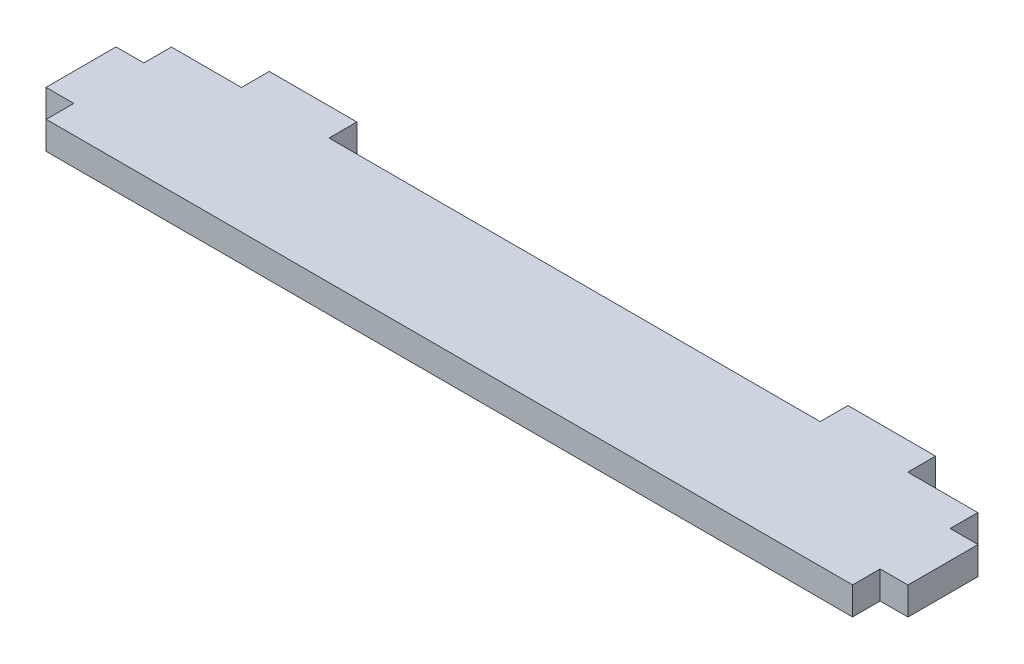
ISO-10303-21;
HEADER;
FILE_DESCRIPTION(('STEP AP214'),'2;1');
FILE_NAME('part.step','',(''),(''),'','','');
FILE_SCHEMA(('AUTOMOTIVE_DESIGN { 1 0 10303 214 1 1 1 1 }'));
ENDSEC;
DATA;
#1=APPLICATION_CONTEXT('core data for automotive mechanical design processes');
#2=APPLICATION_PROTOCOL_DEFINITION('international standard','automotive_design',2000,#1);
#3=PRODUCT_CONTEXT('',#1,'mechanical');
#4=PRODUCT('Part','Part','',(#3));
#5=PRODUCT_RELATED_PRODUCT_CATEGORY('part','',(#4));
#6=PRODUCT_DEFINITION_FORMATION('','',#4);
#7=PRODUCT_DEFINITION_CONTEXT('part definition',#1,'design');
#8=PRODUCT_DEFINITION('design','',#6,#7);
#9=PRODUCT_DEFINITION_SHAPE('','',#8);
#10=(LENGTH_UNIT() NAMED_UNIT(*) SI_UNIT(.MILLI.,.METRE.));
#11=(NAMED_UNIT(*) PLANE_ANGLE_UNIT() SI_UNIT($,.RADIAN.));
#12=(NAMED_UNIT(*) SI_UNIT($,.STERADIAN.) SOLID_ANGLE_UNIT());
#13=UNCERTAINTY_MEASURE_WITH_UNIT(LENGTH_MEASURE(1.E-05),#10,'distance_accuracy_value','');
#14=(GEOMETRIC_REPRESENTATION_CONTEXT(3) GLOBAL_UNCERTAINTY_ASSIGNED_CONTEXT((#13)) GLOBAL_UNIT_ASSIGNED_CONTEXT((#10,
#11,#12)) REPRESENTATION_CONTEXT('',''));
#15=CARTESIAN_POINT('',(0.,0.,0.));
#16=DIRECTION('',(0.,0.,1.));
#17=DIRECTION('',(1.,0.,0.));
#18=AXIS2_PLACEMENT_3D('',#15,#16,#17);
#19=CARTESIAN_POINT('',(46.05,3.175,7.15));
#20=DIRECTION('',(-1.,0.,0.));
#21=DIRECTION('',(0.,0.,1.));
#22=AXIS2_PLACEMENT_3D('',#19,#20,#21);
#23=PLANE('',#22);
#24=DIRECTION('',(0.,0.,-1.));
#25=VECTOR('',#24,1.);
#26=CARTESIAN_POINT('',(46.05,3.175,7.15));
#27=LINE('',#26,#25);
#28=CARTESIAN_POINT('',(46.05,3.175,-4.));
#29=VERTEX_POINT('',#28);
#30=CARTESIAN_POINT('',(46.05,3.175,-7.15000000000001));
#31=VERTEX_POINT('',#30);
#32=EDGE_CURVE('E305',#29,#31,#27,.T.);
#33=ORIENTED_EDGE('',*,*,#32,.F.);
#34=DIRECTION('',(0.,-1.,0.));
#35=VECTOR('',#34,1.);
#36=CARTESIAN_POINT('',(46.05,0.,-4.));
#37=LINE('',#36,#35);
#38=CARTESIAN_POINT('',(46.05,0.,-4.));
#39=VERTEX_POINT('',#38);
#40=EDGE_CURVE('E180',#29,#39,#37,.T.);
#41=ORIENTED_EDGE('',*,*,#40,.T.);
#42=DIRECTION('',(0.,0.,-1.));
#43=VECTOR('',#42,1.);
#44=CARTESIAN_POINT('',(46.05,0.,7.15));
#45=LINE('',#44,#43);
#46=CARTESIAN_POINT('',(46.05,0.,-7.15000000000001));
#47=VERTEX_POINT('',#46);
#48=EDGE_CURVE('E322',#39,#47,#45,.T.);
#49=ORIENTED_EDGE('',*,*,#48,.T.);
#50=DIRECTION('',(0.,-1.,0.));
#51=VECTOR('',#50,1.);
#52=CARTESIAN_POINT('',(46.05,3.175,-7.15000000000001));
#53=LINE('',#52,#51);
#54=EDGE_CURVE('E332',#31,#47,#53,.T.);
#55=ORIENTED_EDGE('',*,*,#54,.F.);
#56=EDGE_LOOP('',(#33,#41,#49,#55));
#57=FACE_BOUND('',#56,.T.);
#58=ADVANCED_FACE('F35',(#57),#23,.F.);
#59=CARTESIAN_POINT('',(-46.05,3.175,7.15000000000001));
#60=DIRECTION('',(1.,0.,0.));
#61=DIRECTION('',(0.,0.,-1.));
#62=AXIS2_PLACEMENT_3D('',#59,#60,#61);
#63=PLANE('',#62);
#64=DIRECTION('',(0.,-1.,0.));
#65=VECTOR('',#64,1.);
#66=CARTESIAN_POINT('',(-46.05,0.,-4.));
#67=LINE('',#66,#65);
#68=CARTESIAN_POINT('',(-46.05,3.175,-4.));
#69=VERTEX_POINT('',#68);
#70=CARTESIAN_POINT('',(-46.05,0.,-4.));
#71=VERTEX_POINT('',#70);
#72=EDGE_CURVE('E58',#69,#71,#67,.T.);
#73=ORIENTED_EDGE('',*,*,#72,.F.);
#74=DIRECTION('',(0.,0.,1.));
#75=VECTOR('',#74,1.);
#76=CARTESIAN_POINT('',(-46.05,3.175,7.15000000000001));
#77=LINE('',#76,#75);
#78=CARTESIAN_POINT('',(-46.05,3.175,-7.14999999999999));
#79=VERTEX_POINT('',#78);
#80=EDGE_CURVE('E298',#79,#69,#77,.T.);
#81=ORIENTED_EDGE('',*,*,#80,.F.);
#82=DIRECTION('',(0.,-1.,0.));
#83=VECTOR('',#82,1.);
#84=CARTESIAN_POINT('',(-46.05,3.175,-7.14999999999999));
#85=LINE('',#84,#83);
#86=CARTESIAN_POINT('',(-46.05,0.,-7.14999999999999));
#87=VERTEX_POINT('',#86);
#88=EDGE_CURVE('E314',#79,#87,#85,.T.);
#89=ORIENTED_EDGE('',*,*,#88,.T.);
#90=DIRECTION('',(0.,0.,1.));
#91=VECTOR('',#90,1.);
#92=CARTESIAN_POINT('',(-46.05,0.,7.15000000000001));
#93=LINE('',#92,#91);
#94=EDGE_CURVE('E316',#87,#71,#93,.T.);
#95=ORIENTED_EDGE('',*,*,#94,.T.);
#96=EDGE_LOOP('',(#73,#81,#89,#95));
#97=FACE_BOUND('',#96,.T.);
#98=ADVANCED_FACE('F37',(#97),#63,.F.);
#99=DIRECTION('',(0.,1.,0.));
#100=VECTOR('',#99,1.);
#101=CARTESIAN_POINT('',(-46.05,0.,4.));
#102=LINE('',#101,#100);
#103=CARTESIAN_POINT('',(-46.05,0.,4.));
#104=VERTEX_POINT('',#103);
#105=CARTESIAN_POINT('',(-46.05,3.175,4.));
#106=VERTEX_POINT('',#105);
#107=EDGE_CURVE('E217',#104,#106,#102,.T.);
#108=ORIENTED_EDGE('',*,*,#107,.F.);
#109=CARTESIAN_POINT('',(-46.05,0.,7.15000000000001));
#110=VERTEX_POINT('',#109);
#111=EDGE_CURVE('E297',#104,#110,#93,.T.);
#112=ORIENTED_EDGE('',*,*,#111,.T.);
#113=DIRECTION('',(0.,-1.,0.));
#114=VECTOR('',#113,1.);
#115=CARTESIAN_POINT('',(-46.05,3.175,7.15000000000001));
#116=LINE('',#115,#114);
#117=CARTESIAN_POINT('',(-46.05,3.175,7.15000000000001));
#118=VERTEX_POINT('',#117);
#119=EDGE_CURVE('E12',#118,#110,#116,.T.);
#120=ORIENTED_EDGE('',*,*,#119,.F.);
#121=EDGE_CURVE('E302',#106,#118,#77,.T.);
#122=ORIENTED_EDGE('',*,*,#121,.F.);
#123=EDGE_LOOP('',(#108,#112,#120,#122));
#124=FACE_BOUND('',#123,.T.);
#125=ADVANCED_FACE('F411',(#124),#63,.F.);
#126=CARTESIAN_POINT('',(46.05,3.175,-7.15000000000001));
#127=DIRECTION('',(0.,0.,1.));
#128=DIRECTION('',(1.,0.,0.));
#129=AXIS2_PLACEMENT_3D('',#126,#127,#128);
#130=PLANE('',#129);
#131=DIRECTION('',(0.,1.,0.));
#132=VECTOR('',#131,1.);
#133=CARTESIAN_POINT('',(-38.05,0.,-7.15));
#134=LINE('',#133,#132);
#135=CARTESIAN_POINT('',(-38.05,0.,-7.15));
#136=VERTEX_POINT('',#135);
#137=CARTESIAN_POINT('',(-38.05,3.175,-7.15));
#138=VERTEX_POINT('',#137);
#139=EDGE_CURVE('E246',#136,#138,#134,.T.);
#140=ORIENTED_EDGE('',*,*,#139,.F.);
#141=DIRECTION('',(-1.,0.,0.));
#142=VECTOR('',#141,1.);
#143=CARTESIAN_POINT('',(46.05,0.,-7.15000000000001));
#144=LINE('',#143,#142);
#145=EDGE_CURVE('E326',#136,#87,#144,.T.);
#146=ORIENTED_EDGE('',*,*,#145,.T.);
#147=ORIENTED_EDGE('',*,*,#88,.F.);
#148=DIRECTION('',(-1.,0.,0.));
#149=VECTOR('',#148,1.);
#150=CARTESIAN_POINT('',(46.05,3.175,-7.15000000000001));
#151=LINE('',#150,#149);
#152=EDGE_CURVE('E308',#138,#79,#151,.T.);
#153=ORIENTED_EDGE('',*,*,#152,.F.);
#154=EDGE_LOOP('',(#140,#146,#147,#153));
#155=FACE_BOUND('',#154,.T.);
#156=ADVANCED_FACE('F390',(#155),#130,.F.);
#157=DIRECTION('',(0.,-1.,0.));
#158=VECTOR('',#157,1.);
#159=CARTESIAN_POINT('',(-28.05,0.,-7.15));
#160=LINE('',#159,#158);
#161=CARTESIAN_POINT('',(-28.05,3.175,-7.15));
#162=VERTEX_POINT('',#161);
#163=CARTESIAN_POINT('',(-28.05,0.,-7.15));
#164=VERTEX_POINT('',#163);
#165=EDGE_CURVE('E251',#162,#164,#160,.T.);
#166=ORIENTED_EDGE('',*,*,#165,.F.);
#167=CARTESIAN_POINT('',(28.05,3.175,-7.15));
#168=VERTEX_POINT('',#167);
#169=EDGE_CURVE('E315',#168,#162,#151,.T.);
#170=ORIENTED_EDGE('',*,*,#169,.F.);
#171=DIRECTION('',(0.,1.,0.));
#172=VECTOR('',#171,1.);
#173=CARTESIAN_POINT('',(28.05,0.,-7.15));
#174=LINE('',#173,#172);
#175=CARTESIAN_POINT('',(28.05,0.,-7.15));
#176=VERTEX_POINT('',#175);
#177=EDGE_CURVE('E273',#176,#168,#174,.T.);
#178=ORIENTED_EDGE('',*,*,#177,.F.);
#179=EDGE_CURVE('E329',#176,#164,#144,.T.);
#180=ORIENTED_EDGE('',*,*,#179,.T.);
#181=EDGE_LOOP('',(#166,#170,#178,#180));
#182=FACE_BOUND('',#181,.T.);
#183=ADVANCED_FACE('F381',(#182),#130,.F.);
#184=DIRECTION('',(0.,-1.,0.));
#185=VECTOR('',#184,1.);
#186=CARTESIAN_POINT('',(38.05,0.,-7.15));
#187=LINE('',#186,#185);
#188=CARTESIAN_POINT('',(38.05,3.175,-7.15));
#189=VERTEX_POINT('',#188);
#190=CARTESIAN_POINT('',(38.05,0.,-7.15));
#191=VERTEX_POINT('',#190);
#192=EDGE_CURVE('E265',#189,#191,#187,.T.);
#193=ORIENTED_EDGE('',*,*,#192,.F.);
#194=EDGE_CURVE('E309',#31,#189,#151,.T.);
#195=ORIENTED_EDGE('',*,*,#194,.F.);
#196=ORIENTED_EDGE('',*,*,#54,.T.);
#197=EDGE_CURVE('E327',#47,#191,#144,.T.);
#198=ORIENTED_EDGE('',*,*,#197,.T.);
#199=EDGE_LOOP('',(#193,#195,#196,#198));
#200=FACE_BOUND('',#199,.T.);
#201=ADVANCED_FACE('F360',(#200),#130,.F.);
#202=CARTESIAN_POINT('',(46.05,3.175,7.15));
#203=DIRECTION('',(0.,0.,-1.));
#204=DIRECTION('',(-1.,0.,0.));
#205=AXIS2_PLACEMENT_3D('',#202,#203,#204);
#206=PLANE('',#205);
#207=DIRECTION('',(1.,0.,0.));
#208=VECTOR('',#207,1.);
#209=CARTESIAN_POINT('',(46.05,0.,7.15));
#210=LINE('',#209,#208);
#211=CARTESIAN_POINT('',(46.05,0.,7.15));
#212=VERTEX_POINT('',#211);
#213=EDGE_CURVE('E320',#110,#212,#210,.T.);
#214=ORIENTED_EDGE('',*,*,#213,.T.);
#215=DIRECTION('',(0.,-1.,0.));
#216=VECTOR('',#215,1.);
#217=CARTESIAN_POINT('',(46.05,3.175,7.15));
#218=LINE('',#217,#216);
#219=CARTESIAN_POINT('',(46.05,3.175,7.15));
#220=VERTEX_POINT('',#219);
#221=EDGE_CURVE('E43',#220,#212,#218,.T.);
#222=ORIENTED_EDGE('',*,*,#221,.F.);
#223=DIRECTION('',(1.,0.,0.));
#224=VECTOR('',#223,1.);
#225=CARTESIAN_POINT('',(46.05,3.175,7.15));
#226=LINE('',#225,#224);
#227=EDGE_CURVE('E301',#118,#220,#226,.T.);
#228=ORIENTED_EDGE('',*,*,#227,.F.);
#229=ORIENTED_EDGE('',*,*,#119,.T.);
#230=EDGE_LOOP('',(#214,#222,#228,#229));
#231=FACE_BOUND('',#230,.T.);
#232=ADVANCED_FACE('F412',(#231),#206,.F.);
#233=CARTESIAN_POINT('',(46.05,0.,4.));
#234=VERTEX_POINT('',#233);
#235=EDGE_CURVE('E323',#212,#234,#45,.T.);
#236=ORIENTED_EDGE('',*,*,#235,.T.);
#237=DIRECTION('',(0.,1.,0.));
#238=VECTOR('',#237,1.);
#239=CARTESIAN_POINT('',(46.05,0.,4.));
#240=LINE('',#239,#238);
#241=CARTESIAN_POINT('',(46.05,3.175,4.));
#242=VERTEX_POINT('',#241);
#243=EDGE_CURVE('E192',#234,#242,#240,.T.);
#244=ORIENTED_EDGE('',*,*,#243,.T.);
#245=EDGE_CURVE('E306',#220,#242,#27,.T.);
#246=ORIENTED_EDGE('',*,*,#245,.F.);
#247=ORIENTED_EDGE('',*,*,#221,.T.);
#248=EDGE_LOOP('',(#236,#244,#246,#247));
#249=FACE_BOUND('',#248,.T.);
#250=ADVANCED_FACE('F339',(#249),#23,.F.);
#251=CARTESIAN_POINT('',(0.,3.175,0.));
#252=DIRECTION('',(0.,1.,0.));
#253=DIRECTION('',(0.,0.,1.));
#254=AXIS2_PLACEMENT_3D('',#251,#252,#253);
#255=PLANE('',#254);
#256=ORIENTED_EDGE('',*,*,#80,.T.);
#257=DIRECTION('',(1.,0.,0.));
#258=VECTOR('',#257,1.);
#259=CARTESIAN_POINT('',(-49.225,3.175,-4.));
#260=LINE('',#259,#258);
#261=CARTESIAN_POINT('',(-49.225,3.175,-4.));
#262=VERTEX_POINT('',#261);
#263=EDGE_CURVE('E224',#262,#69,#260,.T.);
#264=ORIENTED_EDGE('',*,*,#263,.F.);
#265=DIRECTION('',(0.,0.,-1.));
#266=VECTOR('',#265,1.);
#267=CARTESIAN_POINT('',(-49.225,3.175,-4.));
#268=LINE('',#267,#266);
#269=CARTESIAN_POINT('',(-49.225,3.175,4.));
#270=VERTEX_POINT('',#269);
#271=EDGE_CURVE('E221',#270,#262,#268,.T.);
#272=ORIENTED_EDGE('',*,*,#271,.F.);
#273=DIRECTION('',(1.,0.,0.));
#274=VECTOR('',#273,1.);
#275=CARTESIAN_POINT('',(-49.225,3.175,4.));
#276=LINE('',#275,#274);
#277=EDGE_CURVE('E235',#270,#106,#276,.T.);
#278=ORIENTED_EDGE('',*,*,#277,.T.);
#279=ORIENTED_EDGE('',*,*,#121,.T.);
#280=ORIENTED_EDGE('',*,*,#227,.T.);
#281=ORIENTED_EDGE('',*,*,#245,.T.);
#282=DIRECTION('',(-1.,0.,0.));
#283=VECTOR('',#282,1.);
#284=CARTESIAN_POINT('',(49.225,3.175,4.));
#285=LINE('',#284,#283);
#286=CARTESIAN_POINT('',(49.225,3.175,4.));
#287=VERTEX_POINT('',#286);
#288=EDGE_CURVE('E50',#287,#242,#285,.T.);
#289=ORIENTED_EDGE('',*,*,#288,.F.);
#290=DIRECTION('',(0.,0.,-1.));
#291=VECTOR('',#290,1.);
#292=CARTESIAN_POINT('',(49.225,3.175,-4.));
#293=LINE('',#292,#291);
#294=CARTESIAN_POINT('',(49.225,3.175,-4.));
#295=VERTEX_POINT('',#294);
#296=EDGE_CURVE('E189',#287,#295,#293,.T.);
#297=ORIENTED_EDGE('',*,*,#296,.T.);
#298=DIRECTION('',(-1.,0.,0.));
#299=VECTOR('',#298,1.);
#300=CARTESIAN_POINT('',(49.225,3.175,-4.));
#301=LINE('',#300,#299);
#302=EDGE_CURVE('E174',#295,#29,#301,.T.);
#303=ORIENTED_EDGE('',*,*,#302,.T.);
#304=ORIENTED_EDGE('',*,*,#32,.T.);
#305=ORIENTED_EDGE('',*,*,#194,.T.);
#306=DIRECTION('',(0.,0.,1.));
#307=VECTOR('',#306,1.);
#308=CARTESIAN_POINT('',(38.05,3.175,-10.325));
#309=LINE('',#308,#307);
#310=CARTESIAN_POINT('',(38.05,3.175,-10.325));
#311=VERTEX_POINT('',#310);
#312=EDGE_CURVE('E280',#311,#189,#309,.T.);
#313=ORIENTED_EDGE('',*,*,#312,.F.);
#314=DIRECTION('',(1.,0.,0.));
#315=VECTOR('',#314,1.);
#316=CARTESIAN_POINT('',(38.05,3.175,-10.325));
#317=LINE('',#316,#315);
#318=CARTESIAN_POINT('',(28.05,3.175,-10.325));
#319=VERTEX_POINT('',#318);
#320=EDGE_CURVE('E277',#319,#311,#317,.T.);
#321=ORIENTED_EDGE('',*,*,#320,.F.);
#322=DIRECTION('',(0.,0.,1.));
#323=VECTOR('',#322,1.);
#324=CARTESIAN_POINT('',(28.05,3.175,-10.325));
#325=LINE('',#324,#323);
#326=EDGE_CURVE('E287',#319,#168,#325,.T.);
#327=ORIENTED_EDGE('',*,*,#326,.T.);
#328=ORIENTED_EDGE('',*,*,#169,.T.);
#329=DIRECTION('',(0.,0.,1.));
#330=VECTOR('',#329,1.);
#331=CARTESIAN_POINT('',(-28.05,3.175,-10.325));
#332=LINE('',#331,#330);
#333=CARTESIAN_POINT('',(-28.05,3.175,-10.325));
#334=VERTEX_POINT('',#333);
#335=EDGE_CURVE('E266',#334,#162,#332,.T.);
#336=ORIENTED_EDGE('',*,*,#335,.F.);
#337=DIRECTION('',(1.,0.,0.));
#338=VECTOR('',#337,1.);
#339=CARTESIAN_POINT('',(-38.05,3.175,-10.325));
#340=LINE('',#339,#338);
#341=CARTESIAN_POINT('',(-38.05,3.175,-10.325));
#342=VERTEX_POINT('',#341);
#343=EDGE_CURVE('E250',#342,#334,#340,.T.);
#344=ORIENTED_EDGE('',*,*,#343,.F.);
#345=DIRECTION('',(0.,0.,1.));
#346=VECTOR('',#345,1.);
#347=CARTESIAN_POINT('',(-38.05,3.175,-10.325));
#348=LINE('',#347,#346);
#349=EDGE_CURVE('E261',#342,#138,#348,.T.);
#350=ORIENTED_EDGE('',*,*,#349,.T.);
#351=ORIENTED_EDGE('',*,*,#152,.T.);
#352=EDGE_LOOP('',(#256,#264,#272,#278,#279,#280,#281,#289,#297,#303,#304,#305,#313,#321,#327,
#328,#336,#344,#350,#351));
#353=FACE_BOUND('',#352,.T.);
#354=ADVANCED_FACE('F194',(#353),#255,.T.);
#355=CARTESIAN_POINT('',(0.,0.,0.));
#356=DIRECTION('',(0.,1.,0.));
#357=DIRECTION('',(0.,0.,1.));
#358=AXIS2_PLACEMENT_3D('',#355,#356,#357);
#359=PLANE('',#358);
#360=ORIENTED_EDGE('',*,*,#94,.F.);
#361=ORIENTED_EDGE('',*,*,#145,.F.);
#362=DIRECTION('',(0.,0.,1.));
#363=VECTOR('',#362,1.);
#364=CARTESIAN_POINT('',(-38.05,0.,-10.325));
#365=LINE('',#364,#363);
#366=CARTESIAN_POINT('',(-38.05,0.,-10.325));
#367=VERTEX_POINT('',#366);
#368=EDGE_CURVE('E617',#367,#136,#365,.T.);
#369=ORIENTED_EDGE('',*,*,#368,.F.);
#370=DIRECTION('',(-1.,0.,0.));
#371=VECTOR('',#370,1.);
#372=CARTESIAN_POINT('',(-38.05,0.,-10.325));
#373=LINE('',#372,#371);
#374=CARTESIAN_POINT('',(-28.05,0.,-10.325));
#375=VERTEX_POINT('',#374);
#376=EDGE_CURVE('E615',#375,#367,#373,.T.);
#377=ORIENTED_EDGE('',*,*,#376,.F.);
#378=DIRECTION('',(0.,0.,1.));
#379=VECTOR('',#378,1.);
#380=CARTESIAN_POINT('',(-28.05,0.,-10.325));
#381=LINE('',#380,#379);
#382=EDGE_CURVE('E386',#375,#164,#381,.T.);
#383=ORIENTED_EDGE('',*,*,#382,.T.);
#384=ORIENTED_EDGE('',*,*,#179,.F.);
#385=DIRECTION('',(0.,0.,1.));
#386=VECTOR('',#385,1.);
#387=CARTESIAN_POINT('',(28.05,0.,-10.325));
#388=LINE('',#387,#386);
#389=CARTESIAN_POINT('',(28.05,0.,-10.325));
#390=VERTEX_POINT('',#389);
#391=EDGE_CURVE('E291',#390,#176,#388,.T.);
#392=ORIENTED_EDGE('',*,*,#391,.F.);
#393=DIRECTION('',(-1.,0.,0.));
#394=VECTOR('',#393,1.);
#395=CARTESIAN_POINT('',(38.05,0.,-10.325));
#396=LINE('',#395,#394);
#397=CARTESIAN_POINT('',(38.05,0.,-10.325));
#398=VERTEX_POINT('',#397);
#399=EDGE_CURVE('E272',#398,#390,#396,.T.);
#400=ORIENTED_EDGE('',*,*,#399,.F.);
#401=DIRECTION('',(0.,0.,1.));
#402=VECTOR('',#401,1.);
#403=CARTESIAN_POINT('',(38.05,0.,-10.325));
#404=LINE('',#403,#402);
#405=EDGE_CURVE('E295',#398,#191,#404,.T.);
#406=ORIENTED_EDGE('',*,*,#405,.T.);
#407=ORIENTED_EDGE('',*,*,#197,.F.);
#408=ORIENTED_EDGE('',*,*,#48,.F.);
#409=DIRECTION('',(-1.,0.,0.));
#410=VECTOR('',#409,1.);
#411=CARTESIAN_POINT('',(49.225,0.,-4.));
#412=LINE('',#411,#410);
#413=CARTESIAN_POINT('',(49.225,0.,-4.));
#414=VERTEX_POINT('',#413);
#415=EDGE_CURVE('E348',#414,#39,#412,.T.);
#416=ORIENTED_EDGE('',*,*,#415,.F.);
#417=DIRECTION('',(0.,0.,1.));
#418=VECTOR('',#417,1.);
#419=CARTESIAN_POINT('',(49.225,0.,-4.));
#420=LINE('',#419,#418);
#421=CARTESIAN_POINT('',(49.225,0.,4.));
#422=VERTEX_POINT('',#421);
#423=EDGE_CURVE('E191',#414,#422,#420,.T.);
#424=ORIENTED_EDGE('',*,*,#423,.T.);
#425=DIRECTION('',(-1.,0.,0.));
#426=VECTOR('',#425,1.);
#427=CARTESIAN_POINT('',(49.225,0.,4.));
#428=LINE('',#427,#426);
#429=EDGE_CURVE('E347',#422,#234,#428,.T.);
#430=ORIENTED_EDGE('',*,*,#429,.T.);
#431=ORIENTED_EDGE('',*,*,#235,.F.);
#432=ORIENTED_EDGE('',*,*,#213,.F.);
#433=ORIENTED_EDGE('',*,*,#111,.F.);
#434=DIRECTION('',(1.,0.,0.));
#435=VECTOR('',#434,1.);
#436=CARTESIAN_POINT('',(-49.225,0.,4.));
#437=LINE('',#436,#435);
#438=CARTESIAN_POINT('',(-49.225,0.,4.));
#439=VERTEX_POINT('',#438);
#440=EDGE_CURVE('E239',#439,#104,#437,.T.);
#441=ORIENTED_EDGE('',*,*,#440,.F.);
#442=DIRECTION('',(0.,0.,1.));
#443=VECTOR('',#442,1.);
#444=CARTESIAN_POINT('',(-49.225,0.,-4.));
#445=LINE('',#444,#443);
#446=CARTESIAN_POINT('',(-49.225,0.,-4.));
#447=VERTEX_POINT('',#446);
#448=EDGE_CURVE('E216',#447,#439,#445,.T.);
#449=ORIENTED_EDGE('',*,*,#448,.F.);
#450=DIRECTION('',(1.,0.,0.));
#451=VECTOR('',#450,1.);
#452=CARTESIAN_POINT('',(-49.225,0.,-4.));
#453=LINE('',#452,#451);
#454=EDGE_CURVE('E243',#447,#71,#453,.T.);
#455=ORIENTED_EDGE('',*,*,#454,.T.);
#456=EDGE_LOOP('',(#360,#361,#369,#377,#383,#384,#392,#400,#406,#407,#408,#416,#424,#430,#431,
#432,#433,#441,#449,#455));
#457=FACE_BOUND('',#456,.T.);
#458=ADVANCED_FACE('F345',(#457),#359,.F.);
#459=CARTESIAN_POINT('',(38.05,0.,-10.325));
#460=DIRECTION('',(-1.,0.,0.));
#461=DIRECTION('',(0.,0.,1.));
#462=AXIS2_PLACEMENT_3D('',#459,#460,#461);
#463=PLANE('',#462);
#464=ORIENTED_EDGE('',*,*,#192,.T.);
#465=ORIENTED_EDGE('',*,*,#405,.F.);
#466=DIRECTION('',(0.,-1.,0.));
#467=VECTOR('',#466,1.);
#468=CARTESIAN_POINT('',(38.05,0.,-10.325));
#469=LINE('',#468,#467);
#470=EDGE_CURVE('E269',#311,#398,#469,.T.);
#471=ORIENTED_EDGE('',*,*,#470,.F.);
#472=ORIENTED_EDGE('',*,*,#312,.T.);
#473=EDGE_LOOP('',(#464,#465,#471,#472));
#474=FACE_BOUND('',#473,.T.);
#475=ADVANCED_FACE('F367',(#474),#463,.F.);
#476=CARTESIAN_POINT('',(28.05,0.,-10.325));
#477=DIRECTION('',(1.,0.,0.));
#478=DIRECTION('',(0.,0.,-1.));
#479=AXIS2_PLACEMENT_3D('',#476,#477,#478);
#480=PLANE('',#479);
#481=ORIENTED_EDGE('',*,*,#177,.T.);
#482=ORIENTED_EDGE('',*,*,#326,.F.);
#483=DIRECTION('',(0.,1.,0.));
#484=VECTOR('',#483,1.);
#485=CARTESIAN_POINT('',(28.05,0.,-10.325));
#486=LINE('',#485,#484);
#487=EDGE_CURVE('E275',#390,#319,#486,.T.);
#488=ORIENTED_EDGE('',*,*,#487,.F.);
#489=ORIENTED_EDGE('',*,*,#391,.T.);
#490=EDGE_LOOP('',(#481,#482,#488,#489));
#491=FACE_BOUND('',#490,.T.);
#492=ADVANCED_FACE('F378',(#491),#480,.F.);
#493=CARTESIAN_POINT('',(0.,0.,-10.325));
#494=DIRECTION('',(0.,0.,1.));
#495=DIRECTION('',(1.,0.,0.));
#496=AXIS2_PLACEMENT_3D('',#493,#494,#495);
#497=PLANE('',#496);
#498=ORIENTED_EDGE('',*,*,#470,.T.);
#499=ORIENTED_EDGE('',*,*,#399,.T.);
#500=ORIENTED_EDGE('',*,*,#487,.T.);
#501=ORIENTED_EDGE('',*,*,#320,.T.);
#502=EDGE_LOOP('',(#498,#499,#500,#501));
#503=FACE_BOUND('',#502,.T.);
#504=ADVANCED_FACE('F369',(#503),#497,.F.);
#505=CARTESIAN_POINT('',(-38.05,0.,-10.325));
#506=DIRECTION('',(1.,0.,0.));
#507=DIRECTION('',(0.,0.,-1.));
#508=AXIS2_PLACEMENT_3D('',#505,#506,#507);
#509=PLANE('',#508);
#510=ORIENTED_EDGE('',*,*,#139,.T.);
#511=ORIENTED_EDGE('',*,*,#349,.F.);
#512=DIRECTION('',(0.,1.,0.));
#513=VECTOR('',#512,1.);
#514=CARTESIAN_POINT('',(-38.05,0.,-10.325));
#515=LINE('',#514,#513);
#516=EDGE_CURVE('E247',#367,#342,#515,.T.);
#517=ORIENTED_EDGE('',*,*,#516,.F.);
#518=ORIENTED_EDGE('',*,*,#368,.T.);
#519=EDGE_LOOP('',(#510,#511,#517,#518));
#520=FACE_BOUND('',#519,.T.);
#521=ADVANCED_FACE('F435',(#520),#509,.F.);
#522=CARTESIAN_POINT('',(-28.05,0.,-10.325));
#523=DIRECTION('',(-1.,0.,0.));
#524=DIRECTION('',(0.,0.,1.));
#525=AXIS2_PLACEMENT_3D('',#522,#523,#524);
#526=PLANE('',#525);
#527=ORIENTED_EDGE('',*,*,#165,.T.);
#528=ORIENTED_EDGE('',*,*,#382,.F.);
#529=DIRECTION('',(0.,-1.,0.));
#530=VECTOR('',#529,1.);
#531=CARTESIAN_POINT('',(-28.05,0.,-10.325));
#532=LINE('',#531,#530);
#533=EDGE_CURVE('E254',#334,#375,#532,.T.);
#534=ORIENTED_EDGE('',*,*,#533,.F.);
#535=ORIENTED_EDGE('',*,*,#335,.T.);
#536=EDGE_LOOP('',(#527,#528,#534,#535));
#537=FACE_BOUND('',#536,.T.);
#538=ADVANCED_FACE('F438',(#537),#526,.F.);
#539=CARTESIAN_POINT('',(0.,0.,-10.325));
#540=DIRECTION('',(0.,0.,-1.));
#541=DIRECTION('',(-1.,0.,0.));
#542=AXIS2_PLACEMENT_3D('',#539,#540,#541);
#543=PLANE('',#542);
#544=ORIENTED_EDGE('',*,*,#516,.T.);
#545=ORIENTED_EDGE('',*,*,#343,.T.);
#546=ORIENTED_EDGE('',*,*,#533,.T.);
#547=ORIENTED_EDGE('',*,*,#376,.T.);
#548=EDGE_LOOP('',(#544,#545,#546,#547));
#549=FACE_BOUND('',#548,.T.);
#550=ADVANCED_FACE('F442',(#549),#543,.T.);
#551=CARTESIAN_POINT('',(-49.225,0.,-4.));
#552=DIRECTION('',(0.,0.,1.));
#553=DIRECTION('',(1.,0.,0.));
#554=AXIS2_PLACEMENT_3D('',#551,#552,#553);
#555=PLANE('',#554);
#556=ORIENTED_EDGE('',*,*,#72,.T.);
#557=ORIENTED_EDGE('',*,*,#454,.F.);
#558=DIRECTION('',(0.,-1.,0.));
#559=VECTOR('',#558,1.);
#560=CARTESIAN_POINT('',(-49.225,0.,-4.));
#561=LINE('',#560,#559);
#562=EDGE_CURVE('E213',#262,#447,#561,.T.);
#563=ORIENTED_EDGE('',*,*,#562,.F.);
#564=ORIENTED_EDGE('',*,*,#263,.T.);
#565=EDGE_LOOP('',(#556,#557,#563,#564));
#566=FACE_BOUND('',#565,.T.);
#567=ADVANCED_FACE('F399',(#566),#555,.F.);
#568=CARTESIAN_POINT('',(-49.225,0.,4.));
#569=DIRECTION('',(0.,0.,-1.));
#570=DIRECTION('',(-1.,0.,0.));
#571=AXIS2_PLACEMENT_3D('',#568,#569,#570);
#572=PLANE('',#571);
#573=ORIENTED_EDGE('',*,*,#107,.T.);
#574=ORIENTED_EDGE('',*,*,#277,.F.);
#575=DIRECTION('',(0.,1.,0.));
#576=VECTOR('',#575,1.);
#577=CARTESIAN_POINT('',(-49.225,0.,4.));
#578=LINE('',#577,#576);
#579=EDGE_CURVE('E219',#439,#270,#578,.T.);
#580=ORIENTED_EDGE('',*,*,#579,.F.);
#581=ORIENTED_EDGE('',*,*,#440,.T.);
#582=EDGE_LOOP('',(#573,#574,#580,#581));
#583=FACE_BOUND('',#582,.T.);
#584=ADVANCED_FACE('F404',(#583),#572,.F.);
#585=CARTESIAN_POINT('',(-49.225,0.,0.));
#586=DIRECTION('',(1.,0.,0.));
#587=DIRECTION('',(0.,0.,-1.));
#588=AXIS2_PLACEMENT_3D('',#585,#586,#587);
#589=PLANE('',#588);
#590=ORIENTED_EDGE('',*,*,#562,.T.);
#591=ORIENTED_EDGE('',*,*,#448,.T.);
#592=ORIENTED_EDGE('',*,*,#579,.T.);
#593=ORIENTED_EDGE('',*,*,#271,.T.);
#594=EDGE_LOOP('',(#590,#591,#592,#593));
#595=FACE_BOUND('',#594,.T.);
#596=ADVANCED_FACE('F409',(#595),#589,.F.);
#597=CARTESIAN_POINT('',(49.225,0.,-4.));
#598=DIRECTION('',(0.,0.,-1.));
#599=DIRECTION('',(-1.,0.,0.));
#600=AXIS2_PLACEMENT_3D('',#597,#598,#599);
#601=PLANE('',#600);
#602=ORIENTED_EDGE('',*,*,#40,.F.);
#603=ORIENTED_EDGE('',*,*,#302,.F.);
#604=DIRECTION('',(0.,-1.,0.));
#605=VECTOR('',#604,1.);
#606=CARTESIAN_POINT('',(49.225,0.,-4.));
#607=LINE('',#606,#605);
#608=EDGE_CURVE('E177',#295,#414,#607,.T.);
#609=ORIENTED_EDGE('',*,*,#608,.T.);
#610=ORIENTED_EDGE('',*,*,#415,.T.);
#611=EDGE_LOOP('',(#602,#603,#609,#610));
#612=FACE_BOUND('',#611,.T.);
#613=ADVANCED_FACE('F176',(#612),#601,.T.);
#614=CARTESIAN_POINT('',(49.225,0.,4.));
#615=DIRECTION('',(0.,0.,1.));
#616=DIRECTION('',(1.,0.,0.));
#617=AXIS2_PLACEMENT_3D('',#614,#615,#616);
#618=PLANE('',#617);
#619=ORIENTED_EDGE('',*,*,#243,.F.);
#620=ORIENTED_EDGE('',*,*,#429,.F.);
#621=DIRECTION('',(0.,1.,0.));
#622=VECTOR('',#621,1.);
#623=CARTESIAN_POINT('',(49.225,0.,4.));
#624=LINE('',#623,#622);
#625=EDGE_CURVE('E196',#422,#287,#624,.T.);
#626=ORIENTED_EDGE('',*,*,#625,.T.);
#627=ORIENTED_EDGE('',*,*,#288,.T.);
#628=EDGE_LOOP('',(#619,#620,#626,#627));
#629=FACE_BOUND('',#628,.T.);
#630=ADVANCED_FACE('F349',(#629),#618,.T.);
#631=CARTESIAN_POINT('',(49.225,0.,0.));
#632=DIRECTION('',(-1.,0.,0.));
#633=DIRECTION('',(0.,0.,-1.));
#634=AXIS2_PLACEMENT_3D('',#631,#632,#633);
#635=PLANE('',#634);
#636=ORIENTED_EDGE('',*,*,#608,.F.);
#637=ORIENTED_EDGE('',*,*,#296,.F.);
#638=ORIENTED_EDGE('',*,*,#625,.F.);
#639=ORIENTED_EDGE('',*,*,#423,.F.);
#640=EDGE_LOOP('',(#636,#637,#638,#639));
#641=FACE_BOUND('',#640,.T.);
#642=ADVANCED_FACE('F187',(#641),#635,.F.);
#643=CLOSED_SHELL('',(#58,#98,#125,#156,#183,#201,#232,#250,#354,#458,#475,#492,#504,#521,#538,
#550,#567,#584,#596,#613,#630,#642));
#644=MANIFOLD_SOLID_BREP('B2',#643);
#645=ADVANCED_BREP_SHAPE_REPRESENTATION('',(#18,#644),#14);
#646=SHAPE_DEFINITION_REPRESENTATION(#9,#645);
ENDSEC;
END-ISO-10303-21;
